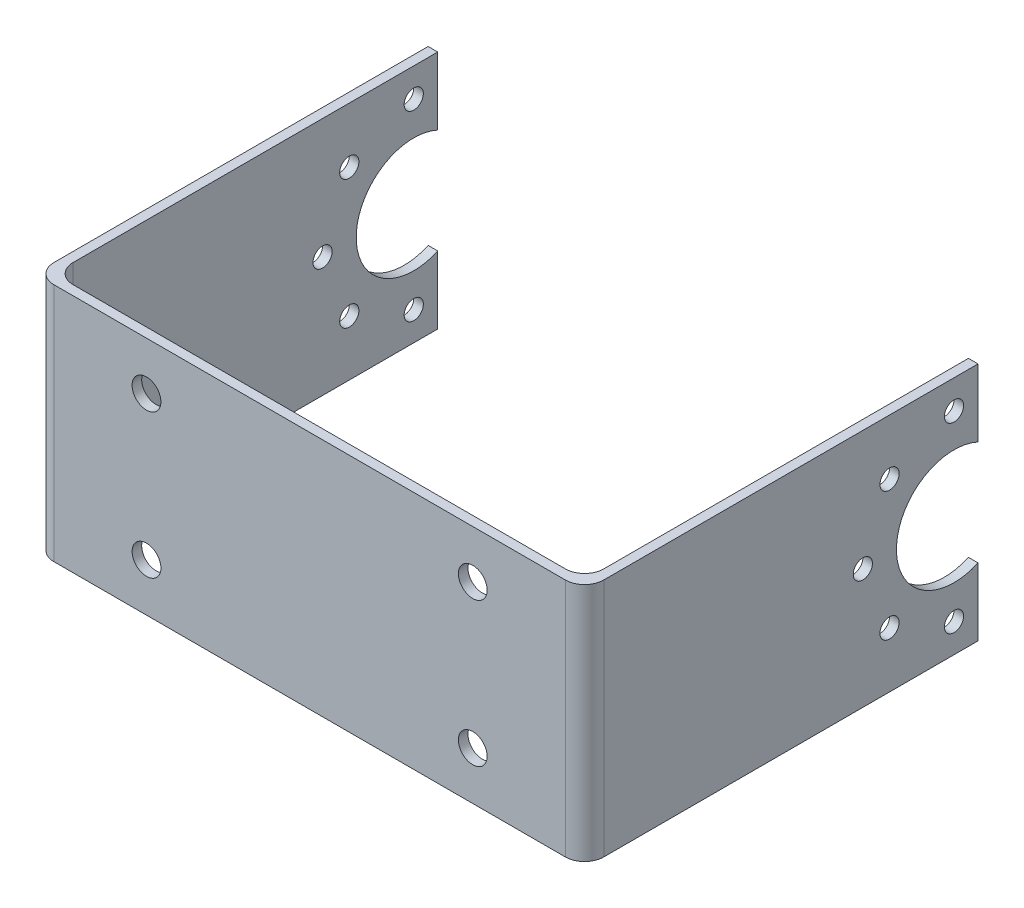
ISO-10303-21;
HEADER;
FILE_DESCRIPTION(('STEP AP214'),'2;1');
FILE_NAME('part.step','',(''),(''),'','','');
FILE_SCHEMA(('AUTOMOTIVE_DESIGN { 1 0 10303 214 1 1 1 1 }'));
ENDSEC;
DATA;
#1=APPLICATION_CONTEXT('core data for automotive mechanical design processes');
#2=APPLICATION_PROTOCOL_DEFINITION('international standard','automotive_design',2000,#1);
#3=PRODUCT_CONTEXT('',#1,'mechanical');
#4=PRODUCT('Part','Part','',(#3));
#5=PRODUCT_RELATED_PRODUCT_CATEGORY('part','',(#4));
#6=PRODUCT_DEFINITION_FORMATION('','',#4);
#7=PRODUCT_DEFINITION_CONTEXT('part definition',#1,'design');
#8=PRODUCT_DEFINITION('design','',#6,#7);
#9=PRODUCT_DEFINITION_SHAPE('','',#8);
#10=(LENGTH_UNIT() NAMED_UNIT(*) SI_UNIT(.MILLI.,.METRE.));
#11=(NAMED_UNIT(*) PLANE_ANGLE_UNIT() SI_UNIT($,.RADIAN.));
#12=(NAMED_UNIT(*) SI_UNIT($,.STERADIAN.) SOLID_ANGLE_UNIT());
#13=UNCERTAINTY_MEASURE_WITH_UNIT(LENGTH_MEASURE(1.E-05),#10,'distance_accuracy_value','');
#14=(GEOMETRIC_REPRESENTATION_CONTEXT(3) GLOBAL_UNCERTAINTY_ASSIGNED_CONTEXT((#13)) GLOBAL_UNIT_ASSIGNED_CONTEXT((#10,
#11,#12)) REPRESENTATION_CONTEXT('',''));
#15=CARTESIAN_POINT('',(0.,0.,0.));
#16=DIRECTION('',(0.,0.,1.));
#17=DIRECTION('',(1.,0.,0.));
#18=AXIS2_PLACEMENT_3D('',#15,#16,#17);
#19=CARTESIAN_POINT('',(34.8000000000001,25.,-40.5));
#20=DIRECTION('',(0.,0.,1.));
#21=DIRECTION('',(1.,0.,0.));
#22=AXIS2_PLACEMENT_3D('',#19,#20,#21);
#23=PLANE('',#22);
#24=DIRECTION('',(0.,-1.,0.));
#25=VECTOR('',#24,1.);
#26=CARTESIAN_POINT('',(33.8000000000001,25.,-40.5));
#27=LINE('',#26,#25);
#28=CARTESIAN_POINT('',(33.8000000000001,7.04564394268215,-40.5));
#29=VERTEX_POINT('',#28);
#30=CARTESIAN_POINT('',(33.8000000000001,0.,-40.5));
#31=VERTEX_POINT('',#30);
#32=EDGE_CURVE('E213',#29,#31,#27,.T.);
#33=ORIENTED_EDGE('',*,*,#32,.F.);
#34=DIRECTION('',(1.,0.,0.));
#35=VECTOR('',#34,1.);
#36=CARTESIAN_POINT('',(-22.4999999999999,7.04564394268215,-40.5));
#37=LINE('',#36,#35);
#38=CARTESIAN_POINT('',(34.8000000000001,7.04564394268215,-40.5));
#39=VERTEX_POINT('',#38);
#40=EDGE_CURVE('E197',#29,#39,#37,.T.);
#41=ORIENTED_EDGE('',*,*,#40,.T.);
#42=DIRECTION('',(0.,-1.,0.));
#43=VECTOR('',#42,1.);
#44=CARTESIAN_POINT('',(34.8000000000001,25.,-40.5));
#45=LINE('',#44,#43);
#46=CARTESIAN_POINT('',(34.8000000000001,0.,-40.5));
#47=VERTEX_POINT('',#46);
#48=EDGE_CURVE('E217',#39,#47,#45,.T.);
#49=ORIENTED_EDGE('',*,*,#48,.T.);
#50=DIRECTION('',(-1.,0.,0.));
#51=VECTOR('',#50,1.);
#52=CARTESIAN_POINT('',(34.8000000000001,0.,-40.5));
#53=LINE('',#52,#51);
#54=EDGE_CURVE('E269',#47,#31,#53,.T.);
#55=ORIENTED_EDGE('',*,*,#54,.T.);
#56=EDGE_LOOP('',(#33,#41,#49,#55));
#57=FACE_BOUND('',#56,.T.);
#58=ADVANCED_FACE('F62',(#57),#23,.F.);
#59=CARTESIAN_POINT('',(-22.4999999999999,25.,-40.5));
#60=DIRECTION('',(0.,0.,1.));
#61=DIRECTION('',(1.,0.,0.));
#62=AXIS2_PLACEMENT_3D('',#59,#60,#61);
#63=PLANE('',#62);
#64=DIRECTION('',(0.,-1.,0.));
#65=VECTOR('',#64,1.);
#66=CARTESIAN_POINT('',(-22.4999999999999,25.,-40.5));
#67=LINE('',#66,#65);
#68=CARTESIAN_POINT('',(-22.4999999999999,7.04564394268215,-40.5));
#69=VERTEX_POINT('',#68);
#70=CARTESIAN_POINT('',(-22.4999999999999,0.,-40.5));
#71=VERTEX_POINT('',#70);
#72=EDGE_CURVE('E204',#69,#71,#67,.T.);
#73=ORIENTED_EDGE('',*,*,#72,.F.);
#74=CARTESIAN_POINT('',(-21.4999999999999,7.04564394268215,-40.5));
#75=VERTEX_POINT('',#74);
#76=EDGE_CURVE('E181',#69,#75,#37,.T.);
#77=ORIENTED_EDGE('',*,*,#76,.T.);
#78=DIRECTION('',(0.,-1.,0.));
#79=VECTOR('',#78,1.);
#80=CARTESIAN_POINT('',(-21.4999999999999,25.,-40.5));
#81=LINE('',#80,#79);
#82=CARTESIAN_POINT('',(-21.4999999999999,0.,-40.5));
#83=VERTEX_POINT('',#82);
#84=EDGE_CURVE('E203',#75,#83,#81,.T.);
#85=ORIENTED_EDGE('',*,*,#84,.T.);
#86=DIRECTION('',(-1.,0.,0.));
#87=VECTOR('',#86,1.);
#88=CARTESIAN_POINT('',(-22.4999999999999,0.,-40.5));
#89=LINE('',#88,#87);
#90=EDGE_CURVE('E295',#83,#71,#89,.T.);
#91=ORIENTED_EDGE('',*,*,#90,.T.);
#92=EDGE_LOOP('',(#73,#77,#85,#91));
#93=FACE_BOUND('',#92,.T.);
#94=ADVANCED_FACE('F447',(#93),#63,.F.);
#95=CARTESIAN_POINT('',(34.8000000000001,25.,-0.500000000000003));
#96=DIRECTION('',(-1.,0.,0.));
#97=DIRECTION('',(0.,0.,1.));
#98=AXIS2_PLACEMENT_3D('',#95,#96,#97);
#99=PLANE('',#98);
#100=CARTESIAN_POINT('',(34.8000000000001,5.7824855787278,-31.2824855787278));
#101=DIRECTION('',(1.,0.,0.));
#102=DIRECTION('',(0.,0.,-1.));
#103=AXIS2_PLACEMENT_3D('',#100,#101,#102);
#104=CIRCLE('',#103,0.999999999999998);
#105=CARTESIAN_POINT('',(34.8000000000001,5.7824855787278,-32.2824855787278));
#106=VERTEX_POINT('',#105);
#107=EDGE_CURVE('E367',#106,#106,#104,.T.);
#108=ORIENTED_EDGE('',*,*,#107,.F.);
#109=EDGE_LOOP('',(#108));
#110=FACE_BOUND('',#109,.T.);
#111=CARTESIAN_POINT('',(34.8000000000001,3.,-38.));
#112=DIRECTION('',(1.,0.,0.));
#113=DIRECTION('',(0.,0.,-1.));
#114=AXIS2_PLACEMENT_3D('',#111,#112,#113);
#115=CIRCLE('',#114,0.999999999999998);
#116=CARTESIAN_POINT('',(34.8000000000001,3.,-39.));
#117=VERTEX_POINT('',#116);
#118=EDGE_CURVE('E355',#117,#117,#115,.T.);
#119=ORIENTED_EDGE('',*,*,#118,.F.);
#120=EDGE_LOOP('',(#119));
#121=FACE_BOUND('',#120,.T.);
#122=CARTESIAN_POINT('',(34.8000000000001,12.5,-28.5));
#123=DIRECTION('',(1.,0.,0.));
#124=DIRECTION('',(0.,0.,-1.));
#125=AXIS2_PLACEMENT_3D('',#122,#123,#124);
#126=CIRCLE('',#125,1.);
#127=CARTESIAN_POINT('',(34.8000000000001,12.5,-29.5));
#128=VERTEX_POINT('',#127);
#129=EDGE_CURVE('E343',#128,#128,#126,.T.);
#130=ORIENTED_EDGE('',*,*,#129,.F.);
#131=EDGE_LOOP('',(#130));
#132=FACE_BOUND('',#131,.T.);
#133=CARTESIAN_POINT('',(34.8000000000001,19.2175144212722,-31.2824855787278));
#134=DIRECTION('',(1.,0.,0.));
#135=DIRECTION('',(0.,0.,-1.));
#136=AXIS2_PLACEMENT_3D('',#133,#134,#135);
#137=CIRCLE('',#136,1.00000000000001);
#138=CARTESIAN_POINT('',(34.8000000000001,19.2175144212722,-32.2824855787278));
#139=VERTEX_POINT('',#138);
#140=EDGE_CURVE('E331',#139,#139,#137,.T.);
#141=ORIENTED_EDGE('',*,*,#140,.F.);
#142=EDGE_LOOP('',(#141));
#143=FACE_BOUND('',#142,.T.);
#144=CARTESIAN_POINT('',(34.8000000000001,22.,-38.));
#145=DIRECTION('',(1.,0.,0.));
#146=DIRECTION('',(0.,0.,-1.));
#147=AXIS2_PLACEMENT_3D('',#144,#145,#146);
#148=CIRCLE('',#147,0.999999999999998);
#149=CARTESIAN_POINT('',(34.8000000000001,22.,-39.));
#150=VERTEX_POINT('',#149);
#151=EDGE_CURVE('E319',#150,#150,#148,.T.);
#152=ORIENTED_EDGE('',*,*,#151,.F.);
#153=EDGE_LOOP('',(#152));
#154=FACE_BOUND('',#153,.T.);
#155=DIRECTION('',(0.,0.,-1.));
#156=VECTOR('',#155,1.);
#157=CARTESIAN_POINT('',(34.8000000000001,25.,-0.500000000000003));
#158=LINE('',#157,#156);
#159=CARTESIAN_POINT('',(34.8000000000001,25.,-1.5));
#160=VERTEX_POINT('',#159);
#161=CARTESIAN_POINT('',(34.8000000000001,25.,-40.5));
#162=VERTEX_POINT('',#161);
#163=EDGE_CURVE('E301',#160,#162,#158,.T.);
#164=ORIENTED_EDGE('',*,*,#163,.F.);
#165=DIRECTION('',(0.,-1.,0.));
#166=VECTOR('',#165,1.);
#167=CARTESIAN_POINT('',(34.8000000000001,25.,-1.5));
#168=LINE('',#167,#166);
#169=CARTESIAN_POINT('',(34.8000000000001,0.,-1.5));
#170=VERTEX_POINT('',#169);
#171=EDGE_CURVE('E243',#160,#170,#168,.T.);
#172=ORIENTED_EDGE('',*,*,#171,.T.);
#173=DIRECTION('',(0.,0.,-1.));
#174=VECTOR('',#173,1.);
#175=CARTESIAN_POINT('',(34.8000000000001,0.,-0.500000000000003));
#176=LINE('',#175,#174);
#177=EDGE_CURVE('E288',#170,#47,#176,.T.);
#178=ORIENTED_EDGE('',*,*,#177,.T.);
#179=ORIENTED_EDGE('',*,*,#48,.F.);
#180=CARTESIAN_POINT('',(34.8000000000001,12.5,-38.));
#181=DIRECTION('',(1.,0.,0.));
#182=DIRECTION('',(0.,0.,-1.));
#183=AXIS2_PLACEMENT_3D('',#180,#181,#182);
#184=CIRCLE('',#183,5.99999999999999);
#185=CARTESIAN_POINT('',(34.8000000000001,17.9543560573178,-40.5));
#186=VERTEX_POINT('',#185);
#187=EDGE_CURVE('E186',#186,#39,#184,.T.);
#188=ORIENTED_EDGE('',*,*,#187,.F.);
#189=EDGE_CURVE('E218',#162,#186,#45,.T.);
#190=ORIENTED_EDGE('',*,*,#189,.F.);
#191=EDGE_LOOP('',(#164,#172,#178,#179,#188,#190));
#192=FACE_BOUND('',#191,.T.);
#193=ADVANCED_FACE('F422',(#110,#121,#132,#143,#154,#192),#99,.F.);
#194=ORIENTED_EDGE('',*,*,#189,.T.);
#195=DIRECTION('',(1.,0.,0.));
#196=VECTOR('',#195,1.);
#197=CARTESIAN_POINT('',(-22.4999999999999,17.9543560573178,-40.5));
#198=LINE('',#197,#196);
#199=CARTESIAN_POINT('',(33.8000000000001,17.9543560573178,-40.5));
#200=VERTEX_POINT('',#199);
#201=EDGE_CURVE('E185',#200,#186,#198,.T.);
#202=ORIENTED_EDGE('',*,*,#201,.F.);
#203=CARTESIAN_POINT('',(33.8000000000001,25.,-40.5));
#204=VERTEX_POINT('',#203);
#205=EDGE_CURVE('E214',#204,#200,#27,.T.);
#206=ORIENTED_EDGE('',*,*,#205,.F.);
#207=DIRECTION('',(-1.,0.,0.));
#208=VECTOR('',#207,1.);
#209=CARTESIAN_POINT('',(34.8000000000001,25.,-40.5));
#210=LINE('',#209,#208);
#211=EDGE_CURVE('E280',#162,#204,#210,.T.);
#212=ORIENTED_EDGE('',*,*,#211,.F.);
#213=EDGE_LOOP('',(#194,#202,#206,#212));
#214=FACE_BOUND('',#213,.T.);
#215=ADVANCED_FACE('F430',(#214),#23,.F.);
#216=CARTESIAN_POINT('',(33.8000000000001,25.,-0.499999999999996));
#217=DIRECTION('',(1.,0.,0.));
#218=DIRECTION('',(0.,0.,-1.));
#219=AXIS2_PLACEMENT_3D('',#216,#217,#218);
#220=PLANE('',#219);
#221=CARTESIAN_POINT('',(33.8000000000001,5.7824855787278,-31.2824855787278));
#222=DIRECTION('',(1.,0.,0.));
#223=DIRECTION('',(0.,0.,-1.));
#224=AXIS2_PLACEMENT_3D('',#221,#222,#223);
#225=CIRCLE('',#224,0.999999999999998);
#226=CARTESIAN_POINT('',(33.8000000000001,5.7824855787278,-32.2824855787278));
#227=VERTEX_POINT('',#226);
#228=EDGE_CURVE('E359',#227,#227,#225,.T.);
#229=ORIENTED_EDGE('',*,*,#228,.T.);
#230=EDGE_LOOP('',(#229));
#231=FACE_BOUND('',#230,.T.);
#232=CARTESIAN_POINT('',(33.8000000000001,3.,-38.));
#233=DIRECTION('',(1.,0.,0.));
#234=DIRECTION('',(0.,0.,-1.));
#235=AXIS2_PLACEMENT_3D('',#232,#233,#234);
#236=CIRCLE('',#235,0.999999999999998);
#237=CARTESIAN_POINT('',(33.8000000000001,3.,-39.));
#238=VERTEX_POINT('',#237);
#239=EDGE_CURVE('E347',#238,#238,#236,.T.);
#240=ORIENTED_EDGE('',*,*,#239,.T.);
#241=EDGE_LOOP('',(#240));
#242=FACE_BOUND('',#241,.T.);
#243=CARTESIAN_POINT('',(33.8000000000001,12.5,-28.5));
#244=DIRECTION('',(1.,0.,0.));
#245=DIRECTION('',(0.,0.,-1.));
#246=AXIS2_PLACEMENT_3D('',#243,#244,#245);
#247=CIRCLE('',#246,1.);
#248=CARTESIAN_POINT('',(33.8000000000001,12.5,-29.5));
#249=VERTEX_POINT('',#248);
#250=EDGE_CURVE('E335',#249,#249,#247,.T.);
#251=ORIENTED_EDGE('',*,*,#250,.T.);
#252=EDGE_LOOP('',(#251));
#253=FACE_BOUND('',#252,.T.);
#254=CARTESIAN_POINT('',(33.8000000000001,19.2175144212722,-31.2824855787278));
#255=DIRECTION('',(1.,0.,0.));
#256=DIRECTION('',(0.,0.,-1.));
#257=AXIS2_PLACEMENT_3D('',#254,#255,#256);
#258=CIRCLE('',#257,1.00000000000001);
#259=CARTESIAN_POINT('',(33.8000000000001,19.2175144212722,-32.2824855787278));
#260=VERTEX_POINT('',#259);
#261=EDGE_CURVE('E323',#260,#260,#258,.T.);
#262=ORIENTED_EDGE('',*,*,#261,.T.);
#263=EDGE_LOOP('',(#262));
#264=FACE_BOUND('',#263,.T.);
#265=CARTESIAN_POINT('',(33.8000000000001,22.,-38.));
#266=DIRECTION('',(1.,0.,0.));
#267=DIRECTION('',(0.,0.,-1.));
#268=AXIS2_PLACEMENT_3D('',#265,#266,#267);
#269=CIRCLE('',#268,0.999999999999998);
#270=CARTESIAN_POINT('',(33.8000000000001,22.,-39.));
#271=VERTEX_POINT('',#270);
#272=EDGE_CURVE('E312',#271,#271,#269,.T.);
#273=ORIENTED_EDGE('',*,*,#272,.T.);
#274=EDGE_LOOP('',(#273));
#275=FACE_BOUND('',#274,.T.);
#276=DIRECTION('',(0.,0.,1.));
#277=VECTOR('',#276,1.);
#278=CARTESIAN_POINT('',(33.8000000000001,0.,-0.499999999999996));
#279=LINE('',#278,#277);
#280=CARTESIAN_POINT('',(33.8000000000001,0.,-2.5));
#281=VERTEX_POINT('',#280);
#282=EDGE_CURVE('E257',#31,#281,#279,.T.);
#283=ORIENTED_EDGE('',*,*,#282,.T.);
#284=DIRECTION('',(0.,-1.,0.));
#285=VECTOR('',#284,1.);
#286=CARTESIAN_POINT('',(33.8000000000001,25.,-2.5));
#287=LINE('',#286,#285);
#288=CARTESIAN_POINT('',(33.8000000000001,25.,-2.5));
#289=VERTEX_POINT('',#288);
#290=EDGE_CURVE('E246',#281,#289,#287,.F.);
#291=ORIENTED_EDGE('',*,*,#290,.T.);
#292=DIRECTION('',(0.,0.,1.));
#293=VECTOR('',#292,1.);
#294=CARTESIAN_POINT('',(33.8000000000001,25.,-0.499999999999996));
#295=LINE('',#294,#293);
#296=EDGE_CURVE('E274',#204,#289,#295,.T.);
#297=ORIENTED_EDGE('',*,*,#296,.F.);
#298=ORIENTED_EDGE('',*,*,#205,.T.);
#299=CARTESIAN_POINT('',(33.8000000000001,12.5,-38.));
#300=DIRECTION('',(1.,0.,0.));
#301=DIRECTION('',(0.,0.,-1.));
#302=AXIS2_PLACEMENT_3D('',#299,#300,#301);
#303=CIRCLE('',#302,5.99999999999999);
#304=EDGE_CURVE('E290',#200,#29,#303,.T.);
#305=ORIENTED_EDGE('',*,*,#304,.T.);
#306=ORIENTED_EDGE('',*,*,#32,.T.);
#307=EDGE_LOOP('',(#283,#291,#297,#298,#305,#306));
#308=FACE_BOUND('',#307,.T.);
#309=ADVANCED_FACE('F263',(#231,#242,#253,#264,#275,#308),#220,.F.);
#310=CARTESIAN_POINT('',(-21.4999999999999,25.,-0.499999999999996));
#311=DIRECTION('',(0.,0.,1.));
#312=DIRECTION('',(1.,0.,0.));
#313=AXIS2_PLACEMENT_3D('',#310,#311,#312);
#314=PLANE('',#313);
#315=CARTESIAN_POINT('',(23.1500000000001,5.,-0.499999999999994));
#316=DIRECTION('',(0.,0.,1.));
#317=DIRECTION('',(1.,0.,0.));
#318=AXIS2_PLACEMENT_3D('',#315,#316,#317);
#319=CIRCLE('',#318,1.5);
#320=CARTESIAN_POINT('',(24.6500000000001,5.,-0.499999999999994));
#321=VERTEX_POINT('',#320);
#322=EDGE_CURVE('E391',#321,#321,#319,.T.);
#323=ORIENTED_EDGE('',*,*,#322,.T.);
#324=EDGE_LOOP('',(#323));
#325=FACE_BOUND('',#324,.T.);
#326=CARTESIAN_POINT('',(23.1500000000001,20.,-0.499999999999994));
#327=DIRECTION('',(0.,0.,1.));
#328=DIRECTION('',(1.,0.,0.));
#329=AXIS2_PLACEMENT_3D('',#326,#327,#328);
#330=CIRCLE('',#329,1.5);
#331=CARTESIAN_POINT('',(24.6500000000001,20.,-0.499999999999994));
#332=VERTEX_POINT('',#331);
#333=EDGE_CURVE('E385',#332,#332,#330,.T.);
#334=ORIENTED_EDGE('',*,*,#333,.T.);
#335=EDGE_LOOP('',(#334));
#336=FACE_BOUND('',#335,.T.);
#337=CARTESIAN_POINT('',(-10.8499999999999,5.,-0.499999999999994));
#338=DIRECTION('',(0.,0.,1.));
#339=DIRECTION('',(1.,0.,0.));
#340=AXIS2_PLACEMENT_3D('',#337,#338,#339);
#341=CIRCLE('',#340,1.5);
#342=CARTESIAN_POINT('',(-9.34999999999994,5.,-0.499999999999994));
#343=VERTEX_POINT('',#342);
#344=EDGE_CURVE('E379',#343,#343,#341,.T.);
#345=ORIENTED_EDGE('',*,*,#344,.T.);
#346=EDGE_LOOP('',(#345));
#347=FACE_BOUND('',#346,.T.);
#348=CARTESIAN_POINT('',(-10.8499999999999,20.,-0.499999999999994));
#349=DIRECTION('',(0.,0.,1.));
#350=DIRECTION('',(1.,0.,0.));
#351=AXIS2_PLACEMENT_3D('',#348,#349,#350);
#352=CIRCLE('',#351,1.5);
#353=CARTESIAN_POINT('',(-9.34999999999994,20.,-0.499999999999994));
#354=VERTEX_POINT('',#353);
#355=EDGE_CURVE('E371',#354,#354,#352,.T.);
#356=ORIENTED_EDGE('',*,*,#355,.T.);
#357=EDGE_LOOP('',(#356));
#358=FACE_BOUND('',#357,.T.);
#359=DIRECTION('',(-1.,0.,0.));
#360=VECTOR('',#359,1.);
#361=CARTESIAN_POINT('',(-21.4999999999999,0.,-0.499999999999996));
#362=LINE('',#361,#360);
#363=CARTESIAN_POINT('',(31.8000000000001,0.,-0.499999999999996));
#364=VERTEX_POINT('',#363);
#365=CARTESIAN_POINT('',(-19.4999999999999,0.,-0.499999999999996));
#366=VERTEX_POINT('',#365);
#367=EDGE_CURVE('E258',#364,#366,#362,.T.);
#368=ORIENTED_EDGE('',*,*,#367,.T.);
#369=DIRECTION('',(0.,-1.,0.));
#370=VECTOR('',#369,1.);
#371=CARTESIAN_POINT('',(-19.4999999999999,25.,-0.499999999999996));
#372=LINE('',#371,#370);
#373=CARTESIAN_POINT('',(-19.4999999999999,25.,-0.499999999999996));
#374=VERTEX_POINT('',#373);
#375=EDGE_CURVE('E85',#366,#374,#372,.F.);
#376=ORIENTED_EDGE('',*,*,#375,.T.);
#377=DIRECTION('',(-1.,0.,0.));
#378=VECTOR('',#377,1.);
#379=CARTESIAN_POINT('',(-21.4999999999999,25.,-0.499999999999996));
#380=LINE('',#379,#378);
#381=CARTESIAN_POINT('',(31.8000000000001,25.,-0.499999999999996));
#382=VERTEX_POINT('',#381);
#383=EDGE_CURVE('E273',#382,#374,#380,.T.);
#384=ORIENTED_EDGE('',*,*,#383,.F.);
#385=DIRECTION('',(0.,-1.,0.));
#386=VECTOR('',#385,1.);
#387=CARTESIAN_POINT('',(31.8000000000001,0.,-0.499999999999996));
#388=LINE('',#387,#386);
#389=EDGE_CURVE('E239',#382,#364,#388,.T.);
#390=ORIENTED_EDGE('',*,*,#389,.T.);
#391=EDGE_LOOP('',(#368,#376,#384,#390));
#392=FACE_BOUND('',#391,.T.);
#393=ADVANCED_FACE('F275',(#325,#336,#347,#358,#392),#314,.F.);
#394=CARTESIAN_POINT('',(-21.4999999999999,25.,-0.499999999999996));
#395=DIRECTION('',(-1.,0.,0.));
#396=DIRECTION('',(0.,0.,1.));
#397=AXIS2_PLACEMENT_3D('',#394,#395,#396);
#398=PLANE('',#397);
#399=CARTESIAN_POINT('',(-21.4999999999999,5.7824855787278,-31.2824855787278));
#400=DIRECTION('',(-1.,0.,0.));
#401=DIRECTION('',(0.,0.,1.));
#402=AXIS2_PLACEMENT_3D('',#399,#400,#401);
#403=CIRCLE('',#402,0.999999999999998);
#404=CARTESIAN_POINT('',(-21.4999999999999,5.7824855787278,-30.2824855787278));
#405=VERTEX_POINT('',#404);
#406=EDGE_CURVE('E364',#405,#405,#403,.T.);
#407=ORIENTED_EDGE('',*,*,#406,.T.);
#408=EDGE_LOOP('',(#407));
#409=FACE_BOUND('',#408,.T.);
#410=CARTESIAN_POINT('',(-21.4999999999999,3.,-38.));
#411=DIRECTION('',(-1.,0.,0.));
#412=DIRECTION('',(0.,0.,1.));
#413=AXIS2_PLACEMENT_3D('',#410,#411,#412);
#414=CIRCLE('',#413,0.999999999999998);
#415=CARTESIAN_POINT('',(-21.4999999999999,3.,-37.));
#416=VERTEX_POINT('',#415);
#417=EDGE_CURVE('E352',#416,#416,#414,.T.);
#418=ORIENTED_EDGE('',*,*,#417,.T.);
#419=EDGE_LOOP('',(#418));
#420=FACE_BOUND('',#419,.T.);
#421=CARTESIAN_POINT('',(-21.4999999999999,12.5,-28.5));
#422=DIRECTION('',(-1.,0.,0.));
#423=DIRECTION('',(0.,0.,1.));
#424=AXIS2_PLACEMENT_3D('',#421,#422,#423);
#425=CIRCLE('',#424,1.);
#426=CARTESIAN_POINT('',(-21.4999999999999,12.5,-27.5));
#427=VERTEX_POINT('',#426);
#428=EDGE_CURVE('E340',#427,#427,#425,.T.);
#429=ORIENTED_EDGE('',*,*,#428,.T.);
#430=EDGE_LOOP('',(#429));
#431=FACE_BOUND('',#430,.T.);
#432=CARTESIAN_POINT('',(-21.4999999999999,19.2175144212722,-31.2824855787278));
#433=DIRECTION('',(-1.,0.,0.));
#434=DIRECTION('',(0.,0.,1.));
#435=AXIS2_PLACEMENT_3D('',#432,#433,#434);
#436=CIRCLE('',#435,1.00000000000001);
#437=CARTESIAN_POINT('',(-21.4999999999999,19.2175144212722,-30.2824855787278));
#438=VERTEX_POINT('',#437);
#439=EDGE_CURVE('E328',#438,#438,#436,.T.);
#440=ORIENTED_EDGE('',*,*,#439,.T.);
#441=EDGE_LOOP('',(#440));
#442=FACE_BOUND('',#441,.T.);
#443=CARTESIAN_POINT('',(-21.4999999999999,22.,-38.));
#444=DIRECTION('',(-1.,0.,0.));
#445=DIRECTION('',(0.,0.,1.));
#446=AXIS2_PLACEMENT_3D('',#443,#444,#445);
#447=CIRCLE('',#446,0.999999999999998);
#448=CARTESIAN_POINT('',(-21.4999999999999,22.,-37.));
#449=VERTEX_POINT('',#448);
#450=EDGE_CURVE('E316',#449,#449,#447,.T.);
#451=ORIENTED_EDGE('',*,*,#450,.T.);
#452=EDGE_LOOP('',(#451));
#453=FACE_BOUND('',#452,.T.);
#454=DIRECTION('',(0.,0.,-1.));
#455=VECTOR('',#454,1.);
#456=CARTESIAN_POINT('',(-21.4999999999999,25.,-0.499999999999996));
#457=LINE('',#456,#455);
#458=CARTESIAN_POINT('',(-21.4999999999999,25.,-2.5));
#459=VERTEX_POINT('',#458);
#460=CARTESIAN_POINT('',(-21.4999999999999,25.,-40.5));
#461=VERTEX_POINT('',#460);
#462=EDGE_CURVE('E276',#459,#461,#457,.T.);
#463=ORIENTED_EDGE('',*,*,#462,.F.);
#464=DIRECTION('',(0.,-1.,0.));
#465=VECTOR('',#464,1.);
#466=CARTESIAN_POINT('',(-21.4999999999999,0.,-2.5));
#467=LINE('',#466,#465);
#468=CARTESIAN_POINT('',(-21.4999999999999,0.,-2.5));
#469=VERTEX_POINT('',#468);
#470=EDGE_CURVE('E236',#459,#469,#467,.T.);
#471=ORIENTED_EDGE('',*,*,#470,.T.);
#472=DIRECTION('',(0.,0.,-1.));
#473=VECTOR('',#472,1.);
#474=CARTESIAN_POINT('',(-21.4999999999999,0.,-0.499999999999996));
#475=LINE('',#474,#473);
#476=EDGE_CURVE('E293',#469,#83,#475,.T.);
#477=ORIENTED_EDGE('',*,*,#476,.T.);
#478=ORIENTED_EDGE('',*,*,#84,.F.);
#479=CARTESIAN_POINT('',(-21.4999999999999,12.5,-38.));
#480=DIRECTION('',(-1.,0.,0.));
#481=DIRECTION('',(0.,0.,1.));
#482=AXIS2_PLACEMENT_3D('',#479,#480,#481);
#483=CIRCLE('',#482,5.99999999999999);
#484=CARTESIAN_POINT('',(-21.4999999999999,17.9543560573178,-40.5));
#485=VERTEX_POINT('',#484);
#486=EDGE_CURVE('E309',#75,#485,#483,.T.);
#487=ORIENTED_EDGE('',*,*,#486,.T.);
#488=EDGE_CURVE('E196',#461,#485,#81,.T.);
#489=ORIENTED_EDGE('',*,*,#488,.F.);
#490=EDGE_LOOP('',(#463,#471,#477,#478,#487,#489));
#491=FACE_BOUND('',#490,.T.);
#492=ADVANCED_FACE('F529',(#409,#420,#431,#442,#453,#491),#398,.F.);
#493=ORIENTED_EDGE('',*,*,#488,.T.);
#494=CARTESIAN_POINT('',(-22.4999999999999,17.9543560573178,-40.5));
#495=VERTEX_POINT('',#494);
#496=EDGE_CURVE('E178',#495,#485,#198,.T.);
#497=ORIENTED_EDGE('',*,*,#496,.F.);
#498=CARTESIAN_POINT('',(-22.4999999999999,25.,-40.5));
#499=VERTEX_POINT('',#498);
#500=EDGE_CURVE('E193',#499,#495,#67,.T.);
#501=ORIENTED_EDGE('',*,*,#500,.F.);
#502=DIRECTION('',(-1.,0.,0.));
#503=VECTOR('',#502,1.);
#504=CARTESIAN_POINT('',(-22.4999999999999,25.,-40.5));
#505=LINE('',#504,#503);
#506=EDGE_CURVE('E278',#461,#499,#505,.T.);
#507=ORIENTED_EDGE('',*,*,#506,.F.);
#508=EDGE_LOOP('',(#493,#497,#501,#507));
#509=FACE_BOUND('',#508,.T.);
#510=ADVANCED_FACE('F191',(#509),#63,.F.);
#511=CARTESIAN_POINT('',(-22.4999999999999,25.,-0.499999999999996));
#512=DIRECTION('',(1.,0.,0.));
#513=DIRECTION('',(0.,0.,-1.));
#514=AXIS2_PLACEMENT_3D('',#511,#512,#513);
#515=PLANE('',#514);
#516=CARTESIAN_POINT('',(-22.4999999999999,5.7824855787278,-31.2824855787278));
#517=DIRECTION('',(1.,0.,0.));
#518=DIRECTION('',(0.,0.,-1.));
#519=AXIS2_PLACEMENT_3D('',#516,#517,#518);
#520=CIRCLE('',#519,0.999999999999998);
#521=CARTESIAN_POINT('',(-22.4999999999999,5.7824855787278,-32.2824855787278));
#522=VERTEX_POINT('',#521);
#523=EDGE_CURVE('E368',#522,#522,#520,.T.);
#524=ORIENTED_EDGE('',*,*,#523,.T.);
#525=EDGE_LOOP('',(#524));
#526=FACE_BOUND('',#525,.T.);
#527=CARTESIAN_POINT('',(-22.4999999999999,3.,-38.));
#528=DIRECTION('',(1.,0.,0.));
#529=DIRECTION('',(0.,0.,-1.));
#530=AXIS2_PLACEMENT_3D('',#527,#528,#529);
#531=CIRCLE('',#530,0.999999999999998);
#532=CARTESIAN_POINT('',(-22.4999999999999,3.,-39.));
#533=VERTEX_POINT('',#532);
#534=EDGE_CURVE('E356',#533,#533,#531,.T.);
#535=ORIENTED_EDGE('',*,*,#534,.T.);
#536=EDGE_LOOP('',(#535));
#537=FACE_BOUND('',#536,.T.);
#538=CARTESIAN_POINT('',(-22.4999999999999,12.5,-28.5));
#539=DIRECTION('',(1.,0.,0.));
#540=DIRECTION('',(0.,0.,-1.));
#541=AXIS2_PLACEMENT_3D('',#538,#539,#540);
#542=CIRCLE('',#541,1.);
#543=CARTESIAN_POINT('',(-22.4999999999999,12.5,-29.5));
#544=VERTEX_POINT('',#543);
#545=EDGE_CURVE('E344',#544,#544,#542,.T.);
#546=ORIENTED_EDGE('',*,*,#545,.T.);
#547=EDGE_LOOP('',(#546));
#548=FACE_BOUND('',#547,.T.);
#549=CARTESIAN_POINT('',(-22.4999999999999,19.2175144212722,-31.2824855787278));
#550=DIRECTION('',(1.,0.,0.));
#551=DIRECTION('',(0.,0.,-1.));
#552=AXIS2_PLACEMENT_3D('',#549,#550,#551);
#553=CIRCLE('',#552,1.00000000000001);
#554=CARTESIAN_POINT('',(-22.4999999999999,19.2175144212722,-32.2824855787278));
#555=VERTEX_POINT('',#554);
#556=EDGE_CURVE('E332',#555,#555,#553,.T.);
#557=ORIENTED_EDGE('',*,*,#556,.T.);
#558=EDGE_LOOP('',(#557));
#559=FACE_BOUND('',#558,.T.);
#560=CARTESIAN_POINT('',(-22.4999999999999,22.,-38.));
#561=DIRECTION('',(1.,0.,0.));
#562=DIRECTION('',(0.,0.,-1.));
#563=AXIS2_PLACEMENT_3D('',#560,#561,#562);
#564=CIRCLE('',#563,0.999999999999998);
#565=CARTESIAN_POINT('',(-22.4999999999999,22.,-39.));
#566=VERTEX_POINT('',#565);
#567=EDGE_CURVE('E320',#566,#566,#564,.T.);
#568=ORIENTED_EDGE('',*,*,#567,.T.);
#569=EDGE_LOOP('',(#568));
#570=FACE_BOUND('',#569,.T.);
#571=DIRECTION('',(0.,0.,1.));
#572=VECTOR('',#571,1.);
#573=CARTESIAN_POINT('',(-22.4999999999999,0.,-0.499999999999996));
#574=LINE('',#573,#572);
#575=CARTESIAN_POINT('',(-22.4999999999999,0.,-1.5));
#576=VERTEX_POINT('',#575);
#577=EDGE_CURVE('E297',#71,#576,#574,.T.);
#578=ORIENTED_EDGE('',*,*,#577,.T.);
#579=DIRECTION('',(0.,-1.,0.));
#580=VECTOR('',#579,1.);
#581=CARTESIAN_POINT('',(-22.4999999999999,25.,-1.5));
#582=LINE('',#581,#580);
#583=CARTESIAN_POINT('',(-22.4999999999999,25.,-1.5));
#584=VERTEX_POINT('',#583);
#585=EDGE_CURVE('E230',#576,#584,#582,.F.);
#586=ORIENTED_EDGE('',*,*,#585,.T.);
#587=DIRECTION('',(0.,0.,1.));
#588=VECTOR('',#587,1.);
#589=CARTESIAN_POINT('',(-22.4999999999999,25.,-0.499999999999996));
#590=LINE('',#589,#588);
#591=EDGE_CURVE('E202',#499,#584,#590,.T.);
#592=ORIENTED_EDGE('',*,*,#591,.F.);
#593=ORIENTED_EDGE('',*,*,#500,.T.);
#594=CARTESIAN_POINT('',(-22.4999999999999,12.5,-38.));
#595=DIRECTION('',(1.,0.,0.));
#596=DIRECTION('',(0.,0.,-1.));
#597=AXIS2_PLACEMENT_3D('',#594,#595,#596);
#598=CIRCLE('',#597,5.99999999999999);
#599=EDGE_CURVE('E175',#495,#69,#598,.T.);
#600=ORIENTED_EDGE('',*,*,#599,.T.);
#601=ORIENTED_EDGE('',*,*,#72,.T.);
#602=EDGE_LOOP('',(#578,#586,#592,#593,#600,#601));
#603=FACE_BOUND('',#602,.T.);
#604=ADVANCED_FACE('F200',(#526,#537,#548,#559,#570,#603),#515,.F.);
#605=CARTESIAN_POINT('',(-22.4999999999999,25.,0.499999999999999));
#606=DIRECTION('',(0.,0.,-1.));
#607=DIRECTION('',(-1.,0.,0.));
#608=AXIS2_PLACEMENT_3D('',#605,#606,#607);
#609=PLANE('',#608);
#610=CARTESIAN_POINT('',(23.1500000000001,5.,0.499999999999998));
#611=DIRECTION('',(0.,0.,1.));
#612=DIRECTION('',(1.,0.,0.));
#613=AXIS2_PLACEMENT_3D('',#610,#611,#612);
#614=CIRCLE('',#613,1.5);
#615=CARTESIAN_POINT('',(24.6500000000001,5.,0.499999999999998));
#616=VERTEX_POINT('',#615);
#617=EDGE_CURVE('E394',#616,#616,#614,.T.);
#618=ORIENTED_EDGE('',*,*,#617,.F.);
#619=EDGE_LOOP('',(#618));
#620=FACE_BOUND('',#619,.T.);
#621=CARTESIAN_POINT('',(23.1500000000001,20.,0.499999999999998));
#622=DIRECTION('',(0.,0.,1.));
#623=DIRECTION('',(1.,0.,0.));
#624=AXIS2_PLACEMENT_3D('',#621,#622,#623);
#625=CIRCLE('',#624,1.5);
#626=CARTESIAN_POINT('',(24.6500000000001,20.,0.499999999999998));
#627=VERTEX_POINT('',#626);
#628=EDGE_CURVE('E388',#627,#627,#625,.T.);
#629=ORIENTED_EDGE('',*,*,#628,.F.);
#630=EDGE_LOOP('',(#629));
#631=FACE_BOUND('',#630,.T.);
#632=CARTESIAN_POINT('',(-10.8499999999999,5.,0.499999999999998));
#633=DIRECTION('',(0.,0.,1.));
#634=DIRECTION('',(1.,0.,0.));
#635=AXIS2_PLACEMENT_3D('',#632,#633,#634);
#636=CIRCLE('',#635,1.5);
#637=CARTESIAN_POINT('',(-9.34999999999994,5.,0.499999999999998));
#638=VERTEX_POINT('',#637);
#639=EDGE_CURVE('E382',#638,#638,#636,.T.);
#640=ORIENTED_EDGE('',*,*,#639,.F.);
#641=EDGE_LOOP('',(#640));
#642=FACE_BOUND('',#641,.T.);
#643=CARTESIAN_POINT('',(-10.8499999999999,20.,0.499999999999998));
#644=DIRECTION('',(0.,0.,1.));
#645=DIRECTION('',(1.,0.,0.));
#646=AXIS2_PLACEMENT_3D('',#643,#644,#645);
#647=CIRCLE('',#646,1.5);
#648=CARTESIAN_POINT('',(-9.34999999999994,20.,0.499999999999998));
#649=VERTEX_POINT('',#648);
#650=EDGE_CURVE('E376',#649,#649,#647,.T.);
#651=ORIENTED_EDGE('',*,*,#650,.F.);
#652=EDGE_LOOP('',(#651));
#653=FACE_BOUND('',#652,.T.);
#654=DIRECTION('',(1.,0.,0.));
#655=VECTOR('',#654,1.);
#656=CARTESIAN_POINT('',(-22.4999999999999,25.,0.499999999999999));
#657=LINE('',#656,#655);
#658=CARTESIAN_POINT('',(-20.4999999999999,25.,0.499999999999999));
#659=VERTEX_POINT('',#658);
#660=CARTESIAN_POINT('',(32.8000000000001,25.,0.499999999999997));
#661=VERTEX_POINT('',#660);
#662=EDGE_CURVE('E208',#659,#661,#657,.T.);
#663=ORIENTED_EDGE('',*,*,#662,.F.);
#664=DIRECTION('',(0.,-1.,0.));
#665=VECTOR('',#664,1.);
#666=CARTESIAN_POINT('',(-20.4999999999999,25.,0.499999999999999));
#667=LINE('',#666,#665);
#668=CARTESIAN_POINT('',(-20.4999999999999,0.,0.499999999999999));
#669=VERTEX_POINT('',#668);
#670=EDGE_CURVE('E223',#659,#669,#667,.T.);
#671=ORIENTED_EDGE('',*,*,#670,.T.);
#672=DIRECTION('',(1.,0.,0.));
#673=VECTOR('',#672,1.);
#674=CARTESIAN_POINT('',(-22.4999999999999,0.,0.499999999999999));
#675=LINE('',#674,#673);
#676=CARTESIAN_POINT('',(32.8000000000001,0.,0.499999999999997));
#677=VERTEX_POINT('',#676);
#678=EDGE_CURVE('E210',#669,#677,#675,.T.);
#679=ORIENTED_EDGE('',*,*,#678,.T.);
#680=DIRECTION('',(0.,-1.,0.));
#681=VECTOR('',#680,1.);
#682=CARTESIAN_POINT('',(32.8000000000001,25.,0.499999999999997));
#683=LINE('',#682,#681);
#684=EDGE_CURVE('E221',#677,#661,#683,.F.);
#685=ORIENTED_EDGE('',*,*,#684,.T.);
#686=EDGE_LOOP('',(#663,#671,#679,#685));
#687=FACE_BOUND('',#686,.T.);
#688=ADVANCED_FACE('F401',(#620,#631,#642,#653,#687),#609,.F.);
#689=CARTESIAN_POINT('',(0.,25.,0.));
#690=DIRECTION('',(0.,1.,0.));
#691=DIRECTION('',(0.,0.,1.));
#692=AXIS2_PLACEMENT_3D('',#689,#690,#691);
#693=PLANE('',#692);
#694=ORIENTED_EDGE('',*,*,#591,.T.);
#695=CARTESIAN_POINT('',(-20.4999999999999,25.,-1.5));
#696=DIRECTION('',(0.,1.,0.));
#697=DIRECTION('',(0.,0.,1.));
#698=AXIS2_PLACEMENT_3D('',#695,#696,#697);
#699=CIRCLE('',#698,2.);
#700=EDGE_CURVE('E234',#584,#659,#699,.T.);
#701=ORIENTED_EDGE('',*,*,#700,.T.);
#702=ORIENTED_EDGE('',*,*,#662,.T.);
#703=CARTESIAN_POINT('',(32.8000000000001,25.,-1.5));
#704=DIRECTION('',(0.,1.,0.));
#705=DIRECTION('',(0.,0.,1.));
#706=AXIS2_PLACEMENT_3D('',#703,#704,#705);
#707=CIRCLE('',#706,2.);
#708=EDGE_CURVE('E232',#661,#160,#707,.T.);
#709=ORIENTED_EDGE('',*,*,#708,.T.);
#710=ORIENTED_EDGE('',*,*,#163,.T.);
#711=ORIENTED_EDGE('',*,*,#211,.T.);
#712=ORIENTED_EDGE('',*,*,#296,.T.);
#713=CARTESIAN_POINT('',(31.8000000000001,25.,-2.5));
#714=DIRECTION('',(0.,1.,0.));
#715=DIRECTION('',(0.,0.,1.));
#716=AXIS2_PLACEMENT_3D('',#713,#714,#715);
#717=CIRCLE('',#716,2.);
#718=EDGE_CURVE('E12',#289,#382,#717,.F.);
#719=ORIENTED_EDGE('',*,*,#718,.T.);
#720=ORIENTED_EDGE('',*,*,#383,.T.);
#721=CARTESIAN_POINT('',(-19.4999999999999,25.,-2.5));
#722=DIRECTION('',(0.,1.,0.));
#723=DIRECTION('',(0.,0.,1.));
#724=AXIS2_PLACEMENT_3D('',#721,#722,#723);
#725=CIRCLE('',#724,2.);
#726=EDGE_CURVE('E77',#374,#459,#725,.F.);
#727=ORIENTED_EDGE('',*,*,#726,.T.);
#728=ORIENTED_EDGE('',*,*,#462,.T.);
#729=ORIENTED_EDGE('',*,*,#506,.T.);
#730=EDGE_LOOP('',(#694,#701,#702,#709,#710,#711,#712,#719,#720,#727,#728,#729));
#731=FACE_BOUND('',#730,.T.);
#732=ADVANCED_FACE('F272',(#731),#693,.T.);
#733=CARTESIAN_POINT('',(0.,0.,0.));
#734=DIRECTION('',(0.,1.,0.));
#735=DIRECTION('',(0.,0.,1.));
#736=AXIS2_PLACEMENT_3D('',#733,#734,#735);
#737=PLANE('',#736);
#738=ORIENTED_EDGE('',*,*,#678,.F.);
#739=CARTESIAN_POINT('',(-20.4999999999999,0.,-1.5));
#740=DIRECTION('',(0.,1.,0.));
#741=DIRECTION('',(0.,0.,1.));
#742=AXIS2_PLACEMENT_3D('',#739,#740,#741);
#743=CIRCLE('',#742,2.);
#744=EDGE_CURVE('E228',#669,#576,#743,.F.);
#745=ORIENTED_EDGE('',*,*,#744,.T.);
#746=ORIENTED_EDGE('',*,*,#577,.F.);
#747=ORIENTED_EDGE('',*,*,#90,.F.);
#748=ORIENTED_EDGE('',*,*,#476,.F.);
#749=CARTESIAN_POINT('',(-19.4999999999999,0.,-2.5));
#750=DIRECTION('',(0.,1.,0.));
#751=DIRECTION('',(0.,0.,1.));
#752=AXIS2_PLACEMENT_3D('',#749,#750,#751);
#753=CIRCLE('',#752,2.);
#754=EDGE_CURVE('E248',#469,#366,#753,.T.);
#755=ORIENTED_EDGE('',*,*,#754,.T.);
#756=ORIENTED_EDGE('',*,*,#367,.F.);
#757=CARTESIAN_POINT('',(31.8000000000001,0.,-2.5));
#758=DIRECTION('',(0.,1.,0.));
#759=DIRECTION('',(0.,0.,1.));
#760=AXIS2_PLACEMENT_3D('',#757,#758,#759);
#761=CIRCLE('',#760,2.);
#762=EDGE_CURVE('E70',#364,#281,#761,.T.);
#763=ORIENTED_EDGE('',*,*,#762,.T.);
#764=ORIENTED_EDGE('',*,*,#282,.F.);
#765=ORIENTED_EDGE('',*,*,#54,.F.);
#766=ORIENTED_EDGE('',*,*,#177,.F.);
#767=CARTESIAN_POINT('',(32.8000000000001,0.,-1.5));
#768=DIRECTION('',(0.,1.,0.));
#769=DIRECTION('',(0.,0.,1.));
#770=AXIS2_PLACEMENT_3D('',#767,#768,#769);
#771=CIRCLE('',#770,2.);
#772=EDGE_CURVE('E226',#170,#677,#771,.F.);
#773=ORIENTED_EDGE('',*,*,#772,.T.);
#774=EDGE_LOOP('',(#738,#745,#746,#747,#748,#755,#756,#763,#764,#765,#766,#773));
#775=FACE_BOUND('',#774,.T.);
#776=ADVANCED_FACE('F255',(#775),#737,.F.);
#777=CARTESIAN_POINT('',(-22.4999999999999,12.5,-38.));
#778=DIRECTION('',(1.,0.,0.));
#779=DIRECTION('',(0.,0.,-1.));
#780=AXIS2_PLACEMENT_3D('',#777,#778,#779);
#781=CYLINDRICAL_SURFACE('',#780,5.99999999999999);
#782=ORIENTED_EDGE('',*,*,#76,.F.);
#783=ORIENTED_EDGE('',*,*,#599,.F.);
#784=ORIENTED_EDGE('',*,*,#496,.T.);
#785=ORIENTED_EDGE('',*,*,#486,.F.);
#786=EDGE_LOOP('',(#782,#783,#784,#785));
#787=FACE_BOUND('',#786,.T.);
#788=ADVANCED_FACE('F177',(#787),#781,.F.);
#789=ORIENTED_EDGE('',*,*,#201,.T.);
#790=ORIENTED_EDGE('',*,*,#187,.T.);
#791=ORIENTED_EDGE('',*,*,#40,.F.);
#792=ORIENTED_EDGE('',*,*,#304,.F.);
#793=EDGE_LOOP('',(#789,#790,#791,#792));
#794=FACE_BOUND('',#793,.T.);
#795=ADVANCED_FACE('F434',(#794),#781,.F.);
#796=CARTESIAN_POINT('',(-22.4999999999999,22.,-38.));
#797=DIRECTION('',(1.,0.,0.));
#798=DIRECTION('',(0.,0.,-1.));
#799=AXIS2_PLACEMENT_3D('',#796,#797,#798);
#800=CYLINDRICAL_SURFACE('',#799,0.999999999999998);
#801=ORIENTED_EDGE('',*,*,#567,.F.);
#802=EDGE_LOOP('',(#801));
#803=FACE_BOUND('',#802,.T.);
#804=ORIENTED_EDGE('',*,*,#450,.F.);
#805=EDGE_LOOP('',(#804));
#806=FACE_BOUND('',#805,.T.);
#807=ADVANCED_FACE('F436',(#803,#806),#800,.F.);
#808=ORIENTED_EDGE('',*,*,#151,.T.);
#809=EDGE_LOOP('',(#808));
#810=FACE_BOUND('',#809,.T.);
#811=ORIENTED_EDGE('',*,*,#272,.F.);
#812=EDGE_LOOP('',(#811));
#813=FACE_BOUND('',#812,.T.);
#814=ADVANCED_FACE('F442',(#810,#813),#800,.F.);
#815=CARTESIAN_POINT('',(-22.4999999999999,19.2175144212722,-31.2824855787278));
#816=DIRECTION('',(1.,0.,0.));
#817=DIRECTION('',(0.,0.,-1.));
#818=AXIS2_PLACEMENT_3D('',#815,#816,#817);
#819=CYLINDRICAL_SURFACE('',#818,1.00000000000001);
#820=ORIENTED_EDGE('',*,*,#556,.F.);
#821=EDGE_LOOP('',(#820));
#822=FACE_BOUND('',#821,.T.);
#823=ORIENTED_EDGE('',*,*,#439,.F.);
#824=EDGE_LOOP('',(#823));
#825=FACE_BOUND('',#824,.T.);
#826=ADVANCED_FACE('F510',(#822,#825),#819,.F.);
#827=ORIENTED_EDGE('',*,*,#140,.T.);
#828=EDGE_LOOP('',(#827));
#829=FACE_BOUND('',#828,.T.);
#830=ORIENTED_EDGE('',*,*,#261,.F.);
#831=EDGE_LOOP('',(#830));
#832=FACE_BOUND('',#831,.T.);
#833=ADVANCED_FACE('F508',(#829,#832),#819,.F.);
#834=CARTESIAN_POINT('',(-22.4999999999999,12.5,-28.5));
#835=DIRECTION('',(1.,0.,0.));
#836=DIRECTION('',(0.,0.,-1.));
#837=AXIS2_PLACEMENT_3D('',#834,#835,#836);
#838=CYLINDRICAL_SURFACE('',#837,1.);
#839=ORIENTED_EDGE('',*,*,#545,.F.);
#840=EDGE_LOOP('',(#839));
#841=FACE_BOUND('',#840,.T.);
#842=ORIENTED_EDGE('',*,*,#428,.F.);
#843=EDGE_LOOP('',(#842));
#844=FACE_BOUND('',#843,.T.);
#845=ADVANCED_FACE('F506',(#841,#844),#838,.F.);
#846=ORIENTED_EDGE('',*,*,#129,.T.);
#847=EDGE_LOOP('',(#846));
#848=FACE_BOUND('',#847,.T.);
#849=ORIENTED_EDGE('',*,*,#250,.F.);
#850=EDGE_LOOP('',(#849));
#851=FACE_BOUND('',#850,.T.);
#852=ADVANCED_FACE('F503',(#848,#851),#838,.F.);
#853=CARTESIAN_POINT('',(-22.4999999999999,3.,-38.));
#854=DIRECTION('',(1.,0.,0.));
#855=DIRECTION('',(0.,0.,-1.));
#856=AXIS2_PLACEMENT_3D('',#853,#854,#855);
#857=CYLINDRICAL_SURFACE('',#856,0.999999999999998);
#858=ORIENTED_EDGE('',*,*,#534,.F.);
#859=EDGE_LOOP('',(#858));
#860=FACE_BOUND('',#859,.T.);
#861=ORIENTED_EDGE('',*,*,#417,.F.);
#862=EDGE_LOOP('',(#861));
#863=FACE_BOUND('',#862,.T.);
#864=ADVANCED_FACE('F501',(#860,#863),#857,.F.);
#865=ORIENTED_EDGE('',*,*,#118,.T.);
#866=EDGE_LOOP('',(#865));
#867=FACE_BOUND('',#866,.T.);
#868=ORIENTED_EDGE('',*,*,#239,.F.);
#869=EDGE_LOOP('',(#868));
#870=FACE_BOUND('',#869,.T.);
#871=ADVANCED_FACE('F498',(#867,#870),#857,.F.);
#872=CARTESIAN_POINT('',(-22.4999999999999,5.7824855787278,-31.2824855787278));
#873=DIRECTION('',(1.,0.,0.));
#874=DIRECTION('',(0.,0.,-1.));
#875=AXIS2_PLACEMENT_3D('',#872,#873,#874);
#876=CYLINDRICAL_SURFACE('',#875,0.999999999999998);
#877=ORIENTED_EDGE('',*,*,#523,.F.);
#878=EDGE_LOOP('',(#877));
#879=FACE_BOUND('',#878,.T.);
#880=ORIENTED_EDGE('',*,*,#406,.F.);
#881=EDGE_LOOP('',(#880));
#882=FACE_BOUND('',#881,.T.);
#883=ADVANCED_FACE('F496',(#879,#882),#876,.F.);
#884=ORIENTED_EDGE('',*,*,#107,.T.);
#885=EDGE_LOOP('',(#884));
#886=FACE_BOUND('',#885,.T.);
#887=ORIENTED_EDGE('',*,*,#228,.F.);
#888=EDGE_LOOP('',(#887));
#889=FACE_BOUND('',#888,.T.);
#890=ADVANCED_FACE('F471',(#886,#889),#876,.F.);
#891=CARTESIAN_POINT('',(-20.4999999999999,25.,-1.5));
#892=DIRECTION('',(0.,-1.,0.));
#893=DIRECTION('',(0.,0.,-1.));
#894=AXIS2_PLACEMENT_3D('',#891,#892,#893);
#895=CYLINDRICAL_SURFACE('',#894,2.);
#896=ORIENTED_EDGE('',*,*,#700,.F.);
#897=ORIENTED_EDGE('',*,*,#585,.F.);
#898=ORIENTED_EDGE('',*,*,#744,.F.);
#899=ORIENTED_EDGE('',*,*,#670,.F.);
#900=EDGE_LOOP('',(#896,#897,#898,#899));
#901=FACE_BOUND('',#900,.T.);
#902=ADVANCED_FACE('F415',(#901),#895,.T.);
#903=CARTESIAN_POINT('',(-19.4999999999999,25.,-2.5));
#904=DIRECTION('',(0.,1.,0.));
#905=DIRECTION('',(0.,0.,1.));
#906=AXIS2_PLACEMENT_3D('',#903,#904,#905);
#907=CYLINDRICAL_SURFACE('',#906,2.);
#908=ORIENTED_EDGE('',*,*,#726,.F.);
#909=ORIENTED_EDGE('',*,*,#375,.F.);
#910=ORIENTED_EDGE('',*,*,#754,.F.);
#911=ORIENTED_EDGE('',*,*,#470,.F.);
#912=EDGE_LOOP('',(#908,#909,#910,#911));
#913=FACE_BOUND('',#912,.T.);
#914=ADVANCED_FACE('F470',(#913),#907,.F.);
#915=CARTESIAN_POINT('',(32.8000000000001,25.,-1.5));
#916=DIRECTION('',(0.,-1.,0.));
#917=DIRECTION('',(0.,0.,-1.));
#918=AXIS2_PLACEMENT_3D('',#915,#916,#917);
#919=CYLINDRICAL_SURFACE('',#918,2.);
#920=ORIENTED_EDGE('',*,*,#708,.F.);
#921=ORIENTED_EDGE('',*,*,#684,.F.);
#922=ORIENTED_EDGE('',*,*,#772,.F.);
#923=ORIENTED_EDGE('',*,*,#171,.F.);
#924=EDGE_LOOP('',(#920,#921,#922,#923));
#925=FACE_BOUND('',#924,.T.);
#926=ADVANCED_FACE('F420',(#925),#919,.T.);
#927=CARTESIAN_POINT('',(31.8000000000001,25.,-2.5));
#928=DIRECTION('',(0.,1.,0.));
#929=DIRECTION('',(0.,0.,1.));
#930=AXIS2_PLACEMENT_3D('',#927,#928,#929);
#931=CYLINDRICAL_SURFACE('',#930,2.);
#932=ORIENTED_EDGE('',*,*,#718,.F.);
#933=ORIENTED_EDGE('',*,*,#290,.F.);
#934=ORIENTED_EDGE('',*,*,#762,.F.);
#935=ORIENTED_EDGE('',*,*,#389,.F.);
#936=EDGE_LOOP('',(#932,#933,#934,#935));
#937=FACE_BOUND('',#936,.T.);
#938=ADVANCED_FACE('F64',(#937),#931,.F.);
#939=CARTESIAN_POINT('',(-10.8499999999999,20.,-40.5));
#940=DIRECTION('',(0.,0.,1.));
#941=DIRECTION('',(1.,0.,0.));
#942=AXIS2_PLACEMENT_3D('',#939,#940,#941);
#943=CYLINDRICAL_SURFACE('',#942,1.5);
#944=ORIENTED_EDGE('',*,*,#650,.T.);
#945=EDGE_LOOP('',(#944));
#946=FACE_BOUND('',#945,.T.);
#947=ORIENTED_EDGE('',*,*,#355,.F.);
#948=EDGE_LOOP('',(#947));
#949=FACE_BOUND('',#948,.T.);
#950=ADVANCED_FACE('F478',(#946,#949),#943,.F.);
#951=CARTESIAN_POINT('',(-10.8499999999999,5.,-40.5));
#952=DIRECTION('',(0.,0.,1.));
#953=DIRECTION('',(1.,0.,0.));
#954=AXIS2_PLACEMENT_3D('',#951,#952,#953);
#955=CYLINDRICAL_SURFACE('',#954,1.5);
#956=ORIENTED_EDGE('',*,*,#639,.T.);
#957=EDGE_LOOP('',(#956));
#958=FACE_BOUND('',#957,.T.);
#959=ORIENTED_EDGE('',*,*,#344,.F.);
#960=EDGE_LOOP('',(#959));
#961=FACE_BOUND('',#960,.T.);
#962=ADVANCED_FACE('F482',(#958,#961),#955,.F.);
#963=CARTESIAN_POINT('',(23.1500000000001,20.,-40.5));
#964=DIRECTION('',(0.,0.,1.));
#965=DIRECTION('',(1.,0.,0.));
#966=AXIS2_PLACEMENT_3D('',#963,#964,#965);
#967=CYLINDRICAL_SURFACE('',#966,1.5);
#968=ORIENTED_EDGE('',*,*,#628,.T.);
#969=EDGE_LOOP('',(#968));
#970=FACE_BOUND('',#969,.T.);
#971=ORIENTED_EDGE('',*,*,#333,.F.);
#972=EDGE_LOOP('',(#971));
#973=FACE_BOUND('',#972,.T.);
#974=ADVANCED_FACE('F488',(#970,#973),#967,.F.);
#975=CARTESIAN_POINT('',(23.1500000000001,5.,-40.5));
#976=DIRECTION('',(0.,0.,1.));
#977=DIRECTION('',(1.,0.,0.));
#978=AXIS2_PLACEMENT_3D('',#975,#976,#977);
#979=CYLINDRICAL_SURFACE('',#978,1.5);
#980=ORIENTED_EDGE('',*,*,#617,.T.);
#981=EDGE_LOOP('',(#980));
#982=FACE_BOUND('',#981,.T.);
#983=ORIENTED_EDGE('',*,*,#322,.F.);
#984=EDGE_LOOP('',(#983));
#985=FACE_BOUND('',#984,.T.);
#986=ADVANCED_FACE('F398',(#982,#985),#979,.F.);
#987=CLOSED_SHELL('',(#58,#94,#193,#215,#309,#393,#492,#510,#604,#688,#732,#776,#788,#795,#807,
#814,#826,#833,#845,#852,#864,#871,#883,#890,#902,#914,#926,#938,#950,#962,#974,#986));
#988=MANIFOLD_SOLID_BREP('B2',#987);
#989=ADVANCED_BREP_SHAPE_REPRESENTATION('',(#18,#988),#14);
#990=SHAPE_DEFINITION_REPRESENTATION(#9,#989);
ENDSEC;
END-ISO-10303-21;
